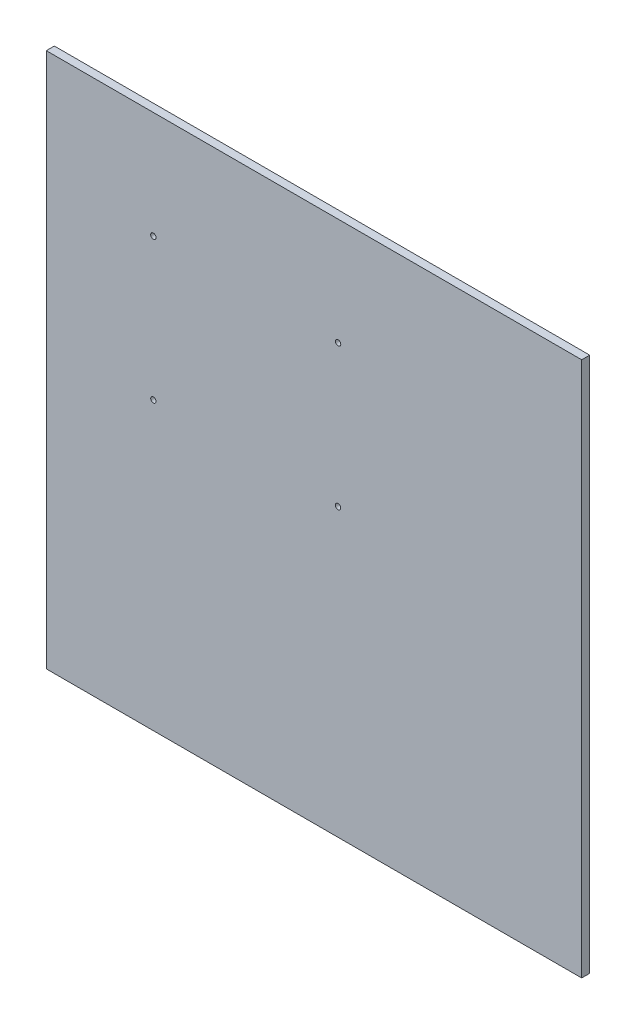
ISO-10303-21;
HEADER;
FILE_DESCRIPTION(('STEP AP214'),'2;1');
FILE_NAME('part.step','',(''),(''),'','','');
FILE_SCHEMA(('AUTOMOTIVE_DESIGN { 1 0 10303 214 1 1 1 1 }'));
ENDSEC;
DATA;
#1=APPLICATION_CONTEXT('core data for automotive mechanical design processes');
#2=APPLICATION_PROTOCOL_DEFINITION('international standard','automotive_design',2000,#1);
#3=PRODUCT_CONTEXT('',#1,'mechanical');
#4=PRODUCT('Part','Part','',(#3));
#5=PRODUCT_RELATED_PRODUCT_CATEGORY('part','',(#4));
#6=PRODUCT_DEFINITION_FORMATION('','',#4);
#7=PRODUCT_DEFINITION_CONTEXT('part definition',#1,'design');
#8=PRODUCT_DEFINITION('design','',#6,#7);
#9=PRODUCT_DEFINITION_SHAPE('','',#8);
#10=(LENGTH_UNIT() NAMED_UNIT(*) SI_UNIT(.MILLI.,.METRE.));
#11=(NAMED_UNIT(*) PLANE_ANGLE_UNIT() SI_UNIT($,.RADIAN.));
#12=(NAMED_UNIT(*) SI_UNIT($,.STERADIAN.) SOLID_ANGLE_UNIT());
#13=UNCERTAINTY_MEASURE_WITH_UNIT(LENGTH_MEASURE(1.E-05),#10,'distance_accuracy_value','');
#14=(GEOMETRIC_REPRESENTATION_CONTEXT(3) GLOBAL_UNCERTAINTY_ASSIGNED_CONTEXT((#13)) GLOBAL_UNIT_ASSIGNED_CONTEXT((#10,
#11,#12)) REPRESENTATION_CONTEXT('',''));
#15=CARTESIAN_POINT('',(0.,0.,0.));
#16=DIRECTION('',(0.,0.,1.));
#17=DIRECTION('',(1.,0.,0.));
#18=AXIS2_PLACEMENT_3D('',#15,#16,#17);
#19=CARTESIAN_POINT('',(0.,0.,3.));
#20=DIRECTION('',(1.,0.,0.));
#21=DIRECTION('',(0.,0.,-1.));
#22=AXIS2_PLACEMENT_3D('',#19,#20,#21);
#23=PLANE('',#22);
#24=DIRECTION('',(0.,-1.,0.));
#25=VECTOR('',#24,1.);
#26=CARTESIAN_POINT('',(0.,0.,0.));
#27=LINE('',#26,#25);
#28=CARTESIAN_POINT('',(0.,200.,0.));
#29=VERTEX_POINT('',#28);
#30=CARTESIAN_POINT('',(0.,0.,0.));
#31=VERTEX_POINT('',#30);
#32=EDGE_CURVE('E106',#29,#31,#27,.T.);
#33=ORIENTED_EDGE('',*,*,#32,.T.);
#34=DIRECTION('',(0.,0.,-1.));
#35=VECTOR('',#34,1.);
#36=CARTESIAN_POINT('',(0.,0.,3.));
#37=LINE('',#36,#35);
#38=CARTESIAN_POINT('',(0.,0.,3.));
#39=VERTEX_POINT('',#38);
#40=EDGE_CURVE('E11',#39,#31,#37,.T.);
#41=ORIENTED_EDGE('',*,*,#40,.F.);
#42=DIRECTION('',(0.,-1.,0.));
#43=VECTOR('',#42,1.);
#44=CARTESIAN_POINT('',(0.,0.,3.));
#45=LINE('',#44,#43);
#46=CARTESIAN_POINT('',(0.,200.,3.));
#47=VERTEX_POINT('',#46);
#48=EDGE_CURVE('E90',#47,#39,#45,.T.);
#49=ORIENTED_EDGE('',*,*,#48,.F.);
#50=DIRECTION('',(0.,0.,-1.));
#51=VECTOR('',#50,1.);
#52=CARTESIAN_POINT('',(0.,200.,3.));
#53=LINE('',#52,#51);
#54=EDGE_CURVE('E102',#47,#29,#53,.T.);
#55=ORIENTED_EDGE('',*,*,#54,.T.);
#56=EDGE_LOOP('',(#33,#41,#49,#55));
#57=FACE_BOUND('',#56,.T.);
#58=ADVANCED_FACE('F38',(#57),#23,.F.);
#59=CARTESIAN_POINT('',(0.,0.,3.));
#60=DIRECTION('',(0.,1.,0.));
#61=DIRECTION('',(0.,0.,1.));
#62=AXIS2_PLACEMENT_3D('',#59,#60,#61);
#63=PLANE('',#62);
#64=DIRECTION('',(1.,0.,0.));
#65=VECTOR('',#64,1.);
#66=CARTESIAN_POINT('',(0.,0.,0.));
#67=LINE('',#66,#65);
#68=CARTESIAN_POINT('',(200.,0.,0.));
#69=VERTEX_POINT('',#68);
#70=EDGE_CURVE('E95',#31,#69,#67,.T.);
#71=ORIENTED_EDGE('',*,*,#70,.T.);
#72=DIRECTION('',(0.,0.,-1.));
#73=VECTOR('',#72,1.);
#74=CARTESIAN_POINT('',(200.,0.,3.));
#75=LINE('',#74,#73);
#76=CARTESIAN_POINT('',(200.,0.,3.));
#77=VERTEX_POINT('',#76);
#78=EDGE_CURVE('E47',#77,#69,#75,.T.);
#79=ORIENTED_EDGE('',*,*,#78,.F.);
#80=DIRECTION('',(1.,0.,0.));
#81=VECTOR('',#80,1.);
#82=CARTESIAN_POINT('',(0.,0.,3.));
#83=LINE('',#82,#81);
#84=EDGE_CURVE('E85',#39,#77,#83,.T.);
#85=ORIENTED_EDGE('',*,*,#84,.F.);
#86=ORIENTED_EDGE('',*,*,#40,.T.);
#87=EDGE_LOOP('',(#71,#79,#85,#86));
#88=FACE_BOUND('',#87,.T.);
#89=ADVANCED_FACE('F94',(#88),#63,.F.);
#90=CARTESIAN_POINT('',(200.,0.,3.));
#91=DIRECTION('',(-1.,0.,0.));
#92=DIRECTION('',(0.,0.,1.));
#93=AXIS2_PLACEMENT_3D('',#90,#91,#92);
#94=PLANE('',#93);
#95=DIRECTION('',(0.,1.,0.));
#96=VECTOR('',#95,1.);
#97=CARTESIAN_POINT('',(200.,0.,0.));
#98=LINE('',#97,#96);
#99=CARTESIAN_POINT('',(200.,200.,0.));
#100=VERTEX_POINT('',#99);
#101=EDGE_CURVE('E72',#69,#100,#98,.T.);
#102=ORIENTED_EDGE('',*,*,#101,.T.);
#103=DIRECTION('',(0.,0.,-1.));
#104=VECTOR('',#103,1.);
#105=CARTESIAN_POINT('',(200.,200.,3.));
#106=LINE('',#105,#104);
#107=CARTESIAN_POINT('',(200.,200.,3.));
#108=VERTEX_POINT('',#107);
#109=EDGE_CURVE('E97',#108,#100,#106,.T.);
#110=ORIENTED_EDGE('',*,*,#109,.F.);
#111=DIRECTION('',(0.,1.,0.));
#112=VECTOR('',#111,1.);
#113=CARTESIAN_POINT('',(200.,0.,3.));
#114=LINE('',#113,#112);
#115=EDGE_CURVE('E88',#77,#108,#114,.T.);
#116=ORIENTED_EDGE('',*,*,#115,.F.);
#117=ORIENTED_EDGE('',*,*,#78,.T.);
#118=EDGE_LOOP('',(#102,#110,#116,#117));
#119=FACE_BOUND('',#118,.T.);
#120=ADVANCED_FACE('F98',(#119),#94,.F.);
#121=CARTESIAN_POINT('',(0.,200.,3.));
#122=DIRECTION('',(0.,-1.,0.));
#123=DIRECTION('',(0.,0.,-1.));
#124=AXIS2_PLACEMENT_3D('',#121,#122,#123);
#125=PLANE('',#124);
#126=DIRECTION('',(-1.,0.,0.));
#127=VECTOR('',#126,1.);
#128=CARTESIAN_POINT('',(0.,200.,0.));
#129=LINE('',#128,#127);
#130=EDGE_CURVE('E78',#100,#29,#129,.T.);
#131=ORIENTED_EDGE('',*,*,#130,.T.);
#132=ORIENTED_EDGE('',*,*,#54,.F.);
#133=DIRECTION('',(-1.,0.,0.));
#134=VECTOR('',#133,1.);
#135=CARTESIAN_POINT('',(0.,200.,3.));
#136=LINE('',#135,#134);
#137=EDGE_CURVE('E55',#108,#47,#136,.T.);
#138=ORIENTED_EDGE('',*,*,#137,.F.);
#139=ORIENTED_EDGE('',*,*,#109,.T.);
#140=EDGE_LOOP('',(#131,#132,#138,#139));
#141=FACE_BOUND('',#140,.T.);
#142=ADVANCED_FACE('F120',(#141),#125,.F.);
#143=CARTESIAN_POINT('',(0.,0.,3.));
#144=DIRECTION('',(0.,0.,-1.));
#145=DIRECTION('',(-1.,0.,0.));
#146=AXIS2_PLACEMENT_3D('',#143,#144,#145);
#147=PLANE('',#146);
#148=CARTESIAN_POINT('',(40.0000000000006,107.,3.));
#149=DIRECTION('',(0.,0.,1.));
#150=DIRECTION('',(1.,0.,0.));
#151=AXIS2_PLACEMENT_3D('',#148,#149,#150);
#152=CIRCLE('',#151,0.999999999999998);
#153=CARTESIAN_POINT('',(41.0000000000006,107.,3.));
#154=VERTEX_POINT('',#153);
#155=EDGE_CURVE('E135',#154,#154,#152,.T.);
#156=ORIENTED_EDGE('',*,*,#155,.F.);
#157=EDGE_LOOP('',(#156));
#158=FACE_BOUND('',#157,.T.);
#159=CARTESIAN_POINT('',(109.000000000001,107.,3.));
#160=DIRECTION('',(0.,0.,1.));
#161=DIRECTION('',(1.,0.,0.));
#162=AXIS2_PLACEMENT_3D('',#159,#160,#161);
#163=CIRCLE('',#162,0.999999999999998);
#164=CARTESIAN_POINT('',(110.000000000001,107.,3.));
#165=VERTEX_POINT('',#164);
#166=EDGE_CURVE('E143',#165,#165,#163,.T.);
#167=ORIENTED_EDGE('',*,*,#166,.F.);
#168=EDGE_LOOP('',(#167));
#169=FACE_BOUND('',#168,.T.);
#170=CARTESIAN_POINT('',(109.,160.,3.));
#171=DIRECTION('',(0.,0.,1.));
#172=DIRECTION('',(1.,0.,0.));
#173=AXIS2_PLACEMENT_3D('',#170,#171,#172);
#174=CIRCLE('',#173,0.999999999999998);
#175=CARTESIAN_POINT('',(110.,160.,3.));
#176=VERTEX_POINT('',#175);
#177=EDGE_CURVE('E151',#176,#176,#174,.T.);
#178=ORIENTED_EDGE('',*,*,#177,.F.);
#179=EDGE_LOOP('',(#178));
#180=FACE_BOUND('',#179,.T.);
#181=CARTESIAN_POINT('',(40.,160.,3.));
#182=DIRECTION('',(0.,0.,1.));
#183=DIRECTION('',(1.,0.,0.));
#184=AXIS2_PLACEMENT_3D('',#181,#182,#183);
#185=CIRCLE('',#184,0.999999999999998);
#186=CARTESIAN_POINT('',(41.,160.,3.));
#187=VERTEX_POINT('',#186);
#188=EDGE_CURVE('E127',#187,#187,#185,.T.);
#189=ORIENTED_EDGE('',*,*,#188,.F.);
#190=EDGE_LOOP('',(#189));
#191=FACE_BOUND('',#190,.T.);
#192=ORIENTED_EDGE('',*,*,#48,.T.);
#193=ORIENTED_EDGE('',*,*,#84,.T.);
#194=ORIENTED_EDGE('',*,*,#115,.T.);
#195=ORIENTED_EDGE('',*,*,#137,.T.);
#196=EDGE_LOOP('',(#192,#193,#194,#195));
#197=FACE_BOUND('',#196,.T.);
#198=ADVANCED_FACE('F86',(#158,#169,#180,#191,#197),#147,.F.);
#199=CARTESIAN_POINT('',(0.,0.,0.));
#200=DIRECTION('',(0.,0.,-1.));
#201=DIRECTION('',(-1.,0.,0.));
#202=AXIS2_PLACEMENT_3D('',#199,#200,#201);
#203=PLANE('',#202);
#204=ORIENTED_EDGE('',*,*,#32,.F.);
#205=ORIENTED_EDGE('',*,*,#130,.F.);
#206=ORIENTED_EDGE('',*,*,#101,.F.);
#207=ORIENTED_EDGE('',*,*,#70,.F.);
#208=EDGE_LOOP('',(#204,#205,#206,#207));
#209=FACE_BOUND('',#208,.T.);
#210=ADVANCED_FACE('F123',(#209),#203,.T.);
#211=CARTESIAN_POINT('',(40.,160.,1.));
#212=DIRECTION('',(0.,0.,1.));
#213=DIRECTION('',(1.,0.,0.));
#214=AXIS2_PLACEMENT_3D('',#211,#212,#213);
#215=CYLINDRICAL_SURFACE('',#214,0.999999999999998);
#216=CARTESIAN_POINT('',(40.,160.,1.));
#217=DIRECTION('',(0.,0.,1.));
#218=DIRECTION('',(1.,0.,0.));
#219=AXIS2_PLACEMENT_3D('',#216,#217,#218);
#220=CIRCLE('',#219,0.999999999999998);
#221=CARTESIAN_POINT('',(41.,160.,1.));
#222=VERTEX_POINT('',#221);
#223=EDGE_CURVE('E110',#222,#222,#220,.T.);
#224=ORIENTED_EDGE('',*,*,#223,.F.);
#225=EDGE_LOOP('',(#224));
#226=FACE_BOUND('',#225,.T.);
#227=ORIENTED_EDGE('',*,*,#188,.T.);
#228=EDGE_LOOP('',(#227));
#229=FACE_BOUND('',#228,.T.);
#230=ADVANCED_FACE('F174',(#226,#229),#215,.F.);
#231=CARTESIAN_POINT('',(40.,160.,1.));
#232=DIRECTION('',(0.,0.,1.));
#233=DIRECTION('',(1.,0.,0.));
#234=AXIS2_PLACEMENT_3D('',#231,#232,#233);
#235=PLANE('',#234);
#236=ORIENTED_EDGE('',*,*,#223,.T.);
#237=EDGE_LOOP('',(#236));
#238=FACE_BOUND('',#237,.T.);
#239=ADVANCED_FACE('F164',(#238),#235,.T.);
#240=CARTESIAN_POINT('',(109.,160.,1.));
#241=DIRECTION('',(0.,0.,1.));
#242=DIRECTION('',(1.,0.,0.));
#243=AXIS2_PLACEMENT_3D('',#240,#241,#242);
#244=CYLINDRICAL_SURFACE('',#243,0.999999999999998);
#245=CARTESIAN_POINT('',(109.,160.,1.));
#246=DIRECTION('',(0.,0.,1.));
#247=DIRECTION('',(1.,0.,0.));
#248=AXIS2_PLACEMENT_3D('',#245,#246,#247);
#249=CIRCLE('',#248,0.999999999999998);
#250=CARTESIAN_POINT('',(110.,160.,1.));
#251=VERTEX_POINT('',#250);
#252=EDGE_CURVE('E131',#251,#251,#249,.T.);
#253=ORIENTED_EDGE('',*,*,#252,.F.);
#254=EDGE_LOOP('',(#253));
#255=FACE_BOUND('',#254,.T.);
#256=ORIENTED_EDGE('',*,*,#177,.T.);
#257=EDGE_LOOP('',(#256));
#258=FACE_BOUND('',#257,.T.);
#259=ADVANCED_FACE('F161',(#255,#258),#244,.F.);
#260=CARTESIAN_POINT('',(109.,160.,1.));
#261=DIRECTION('',(0.,0.,1.));
#262=DIRECTION('',(1.,0.,0.));
#263=AXIS2_PLACEMENT_3D('',#260,#261,#262);
#264=PLANE('',#263);
#265=ORIENTED_EDGE('',*,*,#252,.T.);
#266=EDGE_LOOP('',(#265));
#267=FACE_BOUND('',#266,.T.);
#268=ADVANCED_FACE('F159',(#267),#264,.T.);
#269=CARTESIAN_POINT('',(109.000000000001,107.,1.));
#270=DIRECTION('',(0.,0.,1.));
#271=DIRECTION('',(1.,0.,0.));
#272=AXIS2_PLACEMENT_3D('',#269,#270,#271);
#273=CYLINDRICAL_SURFACE('',#272,0.999999999999998);
#274=CARTESIAN_POINT('',(109.000000000001,107.,1.));
#275=DIRECTION('',(0.,0.,1.));
#276=DIRECTION('',(1.,0.,0.));
#277=AXIS2_PLACEMENT_3D('',#274,#275,#276);
#278=CIRCLE('',#277,0.999999999999998);
#279=CARTESIAN_POINT('',(110.000000000001,107.,1.));
#280=VERTEX_POINT('',#279);
#281=EDGE_CURVE('E147',#280,#280,#278,.T.);
#282=ORIENTED_EDGE('',*,*,#281,.F.);
#283=EDGE_LOOP('',(#282));
#284=FACE_BOUND('',#283,.T.);
#285=ORIENTED_EDGE('',*,*,#166,.T.);
#286=EDGE_LOOP('',(#285));
#287=FACE_BOUND('',#286,.T.);
#288=ADVANCED_FACE('F234',(#284,#287),#273,.F.);
#289=CARTESIAN_POINT('',(109.000000000001,107.,1.));
#290=DIRECTION('',(0.,0.,1.));
#291=DIRECTION('',(1.,0.,0.));
#292=AXIS2_PLACEMENT_3D('',#289,#290,#291);
#293=PLANE('',#292);
#294=ORIENTED_EDGE('',*,*,#281,.T.);
#295=EDGE_LOOP('',(#294));
#296=FACE_BOUND('',#295,.T.);
#297=ADVANCED_FACE('F242',(#296),#293,.T.);
#298=CARTESIAN_POINT('',(40.0000000000006,107.,1.));
#299=DIRECTION('',(0.,0.,1.));
#300=DIRECTION('',(1.,0.,0.));
#301=AXIS2_PLACEMENT_3D('',#298,#299,#300);
#302=CYLINDRICAL_SURFACE('',#301,0.999999999999998);
#303=CARTESIAN_POINT('',(40.0000000000006,107.,1.));
#304=DIRECTION('',(0.,0.,1.));
#305=DIRECTION('',(1.,0.,0.));
#306=AXIS2_PLACEMENT_3D('',#303,#304,#305);
#307=CIRCLE('',#306,0.999999999999998);
#308=CARTESIAN_POINT('',(41.0000000000006,107.,1.));
#309=VERTEX_POINT('',#308);
#310=EDGE_CURVE('E139',#309,#309,#307,.T.);
#311=ORIENTED_EDGE('',*,*,#310,.F.);
#312=EDGE_LOOP('',(#311));
#313=FACE_BOUND('',#312,.T.);
#314=ORIENTED_EDGE('',*,*,#155,.T.);
#315=EDGE_LOOP('',(#314));
#316=FACE_BOUND('',#315,.T.);
#317=ADVANCED_FACE('F251',(#313,#316),#302,.F.);
#318=CARTESIAN_POINT('',(40.0000000000006,107.,1.));
#319=DIRECTION('',(0.,0.,1.));
#320=DIRECTION('',(1.,0.,0.));
#321=AXIS2_PLACEMENT_3D('',#318,#319,#320);
#322=PLANE('',#321);
#323=ORIENTED_EDGE('',*,*,#310,.T.);
#324=EDGE_LOOP('',(#323));
#325=FACE_BOUND('',#324,.T.);
#326=ADVANCED_FACE('F260',(#325),#322,.T.);
#327=CLOSED_SHELL('',(#58,#89,#120,#142,#198,#210,#230,#239,#259,#268,#288,#297,#317,#326));
#328=MANIFOLD_SOLID_BREP('B2',#327);
#329=ADVANCED_BREP_SHAPE_REPRESENTATION('',(#18,#328),#14);
#330=SHAPE_DEFINITION_REPRESENTATION(#9,#329);
ENDSEC;
END-ISO-10303-21;
